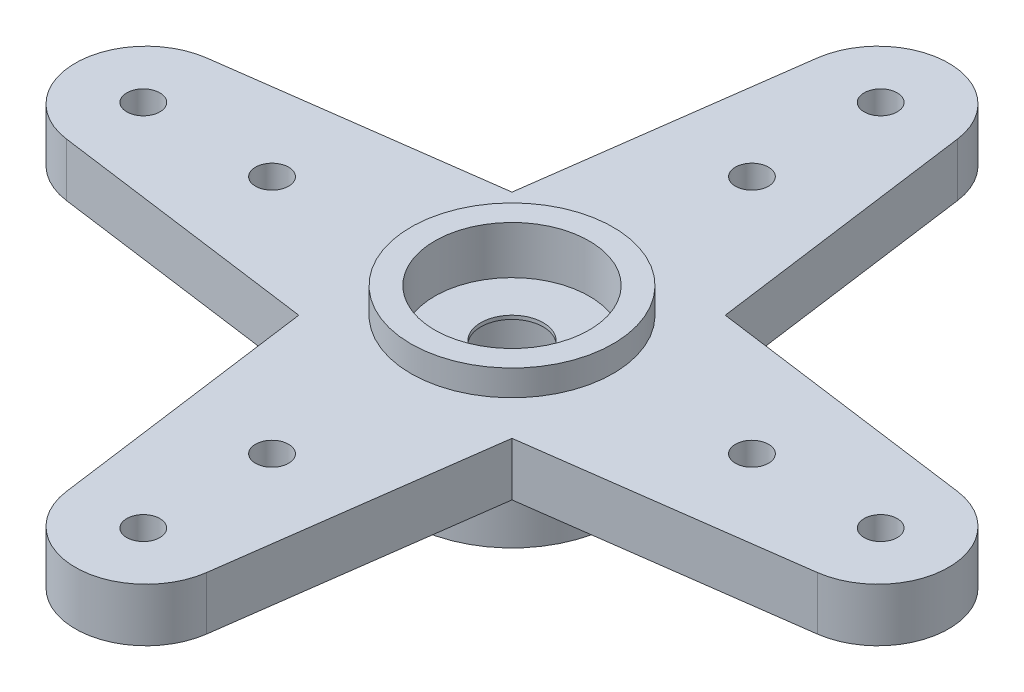
ISO-10303-21;
HEADER;
FILE_DESCRIPTION(('STEP AP214'),'2;1');
FILE_NAME('part.step','',(''),(''),'','','');
FILE_SCHEMA(('AUTOMOTIVE_DESIGN { 1 0 10303 214 1 1 1 1 }'));
ENDSEC;
DATA;
#1=APPLICATION_CONTEXT('core data for automotive mechanical design processes');
#2=APPLICATION_PROTOCOL_DEFINITION('international standard','automotive_design',2000,#1);
#3=PRODUCT_CONTEXT('',#1,'mechanical');
#4=PRODUCT('Part','Part','',(#3));
#5=PRODUCT_RELATED_PRODUCT_CATEGORY('part','',(#4));
#6=PRODUCT_DEFINITION_FORMATION('','',#4);
#7=PRODUCT_DEFINITION_CONTEXT('part definition',#1,'design');
#8=PRODUCT_DEFINITION('design','',#6,#7);
#9=PRODUCT_DEFINITION_SHAPE('','',#8);
#10=(LENGTH_UNIT() NAMED_UNIT(*) SI_UNIT(.MILLI.,.METRE.));
#11=(NAMED_UNIT(*) PLANE_ANGLE_UNIT() SI_UNIT($,.RADIAN.));
#12=(NAMED_UNIT(*) SI_UNIT($,.STERADIAN.) SOLID_ANGLE_UNIT());
#13=UNCERTAINTY_MEASURE_WITH_UNIT(LENGTH_MEASURE(1.E-05),#10,'distance_accuracy_value','');
#14=(GEOMETRIC_REPRESENTATION_CONTEXT(3) GLOBAL_UNCERTAINTY_ASSIGNED_CONTEXT((#13)) GLOBAL_UNIT_ASSIGNED_CONTEXT((#10,
#11,#12)) REPRESENTATION_CONTEXT('',''));
#15=CARTESIAN_POINT('',(0.,0.,0.));
#16=DIRECTION('',(0.,0.,1.));
#17=DIRECTION('',(1.,0.,0.));
#18=AXIS2_PLACEMENT_3D('',#15,#16,#17);
#19=CARTESIAN_POINT('',(0.,0.,0.));
#20=DIRECTION('',(0.,1.,0.));
#21=DIRECTION('',(0.,0.,1.));
#22=AXIS2_PLACEMENT_3D('',#19,#20,#21);
#23=CYLINDRICAL_SURFACE('',#22,0.85);
#24=CARTESIAN_POINT('',(0.,2.85,0.));
#25=DIRECTION('',(0.,1.,0.));
#26=DIRECTION('',(0.,0.,1.));
#27=AXIS2_PLACEMENT_3D('',#24,#25,#26);
#28=CIRCLE('',#27,0.85);
#29=CARTESIAN_POINT('',(0.,2.85,0.85));
#30=VERTEX_POINT('',#29);
#31=EDGE_CURVE('E217',#30,#30,#28,.T.);
#32=ORIENTED_EDGE('',*,*,#31,.T.);
#33=EDGE_LOOP('',(#32));
#34=FACE_BOUND('',#33,.T.);
#35=CARTESIAN_POINT('',(0.,2.75,0.));
#36=DIRECTION('',(0.,-1.,0.));
#37=DIRECTION('',(0.,0.,-1.));
#38=AXIS2_PLACEMENT_3D('',#35,#36,#37);
#39=CIRCLE('',#38,0.85);
#40=CARTESIAN_POINT('',(0.,2.75,-0.85));
#41=VERTEX_POINT('',#40);
#42=EDGE_CURVE('E39',#41,#41,#39,.F.);
#43=ORIENTED_EDGE('',*,*,#42,.F.);
#44=EDGE_LOOP('',(#43));
#45=FACE_BOUND('',#44,.T.);
#46=ADVANCED_FACE('F35',(#34,#45),#23,.F.);
#47=CARTESIAN_POINT('',(0.,0.,0.));
#48=DIRECTION('',(0.,1.,0.));
#49=DIRECTION('',(0.,0.,1.));
#50=AXIS2_PLACEMENT_3D('',#47,#48,#49);
#51=PLANE('',#50);
#52=CARTESIAN_POINT('',(0.,0.,0.));
#53=DIRECTION('',(0.,1.,0.));
#54=DIRECTION('',(0.,0.,1.));
#55=AXIS2_PLACEMENT_3D('',#52,#53,#54);
#56=CIRCLE('',#55,2.875);
#57=CARTESIAN_POINT('',(0.,0.,2.875));
#58=VERTEX_POINT('',#57);
#59=EDGE_CURVE('E45',#58,#58,#56,.T.);
#60=ORIENTED_EDGE('',*,*,#59,.F.);
#61=EDGE_LOOP('',(#60));
#62=FACE_BOUND('',#61,.T.);
#63=CARTESIAN_POINT('',(0.,0.,0.));
#64=DIRECTION('',(0.,1.,0.));
#65=DIRECTION('',(0.,0.,1.));
#66=AXIS2_PLACEMENT_3D('',#63,#64,#65);
#67=CIRCLE('',#66,1.925);
#68=CARTESIAN_POINT('',(0.,0.,1.925));
#69=VERTEX_POINT('',#68);
#70=EDGE_CURVE('E209',#69,#69,#67,.T.);
#71=ORIENTED_EDGE('',*,*,#70,.T.);
#72=EDGE_LOOP('',(#71));
#73=FACE_BOUND('',#72,.T.);
#74=ADVANCED_FACE('F346',(#62,#73),#51,.F.);
#75=CARTESIAN_POINT('',(0.,2.,0.));
#76=DIRECTION('',(0.,-1.,0.));
#77=DIRECTION('',(0.,0.,-1.));
#78=AXIS2_PLACEMENT_3D('',#75,#76,#77);
#79=CYLINDRICAL_SURFACE('',#78,2.875);
#80=CARTESIAN_POINT('',(0.,2.,0.));
#81=DIRECTION('',(0.,1.,0.));
#82=DIRECTION('',(0.,0.,1.));
#83=AXIS2_PLACEMENT_3D('',#80,#81,#82);
#84=CIRCLE('',#83,2.875);
#85=CARTESIAN_POINT('',(0.,2.,2.875));
#86=VERTEX_POINT('',#85);
#87=EDGE_CURVE('E11',#86,#86,#84,.T.);
#88=ORIENTED_EDGE('',*,*,#87,.F.);
#89=EDGE_LOOP('',(#88));
#90=FACE_BOUND('',#89,.T.);
#91=ORIENTED_EDGE('',*,*,#59,.T.);
#92=EDGE_LOOP('',(#91));
#93=FACE_BOUND('',#92,.T.);
#94=ADVANCED_FACE('F37',(#90,#93),#79,.T.);
#95=CARTESIAN_POINT('',(0.,2.,0.));
#96=DIRECTION('',(0.,-1.,0.));
#97=DIRECTION('',(0.,0.,-1.));
#98=AXIS2_PLACEMENT_3D('',#95,#96,#97);
#99=CYLINDRICAL_SURFACE('',#98,1.925);
#100=ORIENTED_EDGE('',*,*,#70,.F.);
#101=EDGE_LOOP('',(#100));
#102=FACE_BOUND('',#101,.T.);
#103=CARTESIAN_POINT('',(0.,2.75,0.));
#104=DIRECTION('',(0.,-1.,0.));
#105=DIRECTION('',(0.,0.,-1.));
#106=AXIS2_PLACEMENT_3D('',#103,#104,#105);
#107=CIRCLE('',#106,1.925);
#108=CARTESIAN_POINT('',(0.,2.75,-1.925));
#109=VERTEX_POINT('',#108);
#110=EDGE_CURVE('E254',#109,#109,#107,.T.);
#111=ORIENTED_EDGE('',*,*,#110,.F.);
#112=EDGE_LOOP('',(#111));
#113=FACE_BOUND('',#112,.T.);
#114=ADVANCED_FACE('F503',(#102,#113),#99,.F.);
#115=CARTESIAN_POINT('',(-0.4385730975185,3.45,-3.23293299338573));
#116=DIRECTION('',(-0.134426667429611,0.,-0.990923544519843));
#117=DIRECTION('',(-0.990923544519843,0.,0.134426667429611));
#118=AXIS2_PLACEMENT_3D('',#115,#116,#117);
#119=PLANE('',#118);
#120=DIRECTION('',(0.990923544519843,0.,-0.134426667429611));
#121=VECTOR('',#120,1.);
#122=CARTESIAN_POINT('',(-0.4385730975185,2.,-3.23293299338573));
#123=LINE('',#122,#121);
#124=CARTESIAN_POINT('',(-10.208771334802,2.,-1.9075278232007));
#125=VERTEX_POINT('',#124);
#126=CARTESIAN_POINT('',(-2.89913780286484,2.,-2.89913780286484));
#127=VERTEX_POINT('',#126);
#128=EDGE_CURVE('E158',#125,#127,#123,.T.);
#129=ORIENTED_EDGE('',*,*,#128,.F.);
#130=DIRECTION('',(0.,-1.,0.));
#131=VECTOR('',#130,1.);
#132=CARTESIAN_POINT('',(-10.208771334802,3.45,-1.9075278232007));
#133=LINE('',#132,#131);
#134=CARTESIAN_POINT('',(-10.208771334802,3.45,-1.9075278232007));
#135=VERTEX_POINT('',#134);
#136=EDGE_CURVE('E106',#135,#125,#133,.T.);
#137=ORIENTED_EDGE('',*,*,#136,.F.);
#138=DIRECTION('',(0.990923544519843,0.,-0.134426667429611));
#139=VECTOR('',#138,1.);
#140=CARTESIAN_POINT('',(-0.4385730975185,3.45,-3.23293299338573));
#141=LINE('',#140,#139);
#142=CARTESIAN_POINT('',(-2.89913780286484,3.45,-2.89913780286484));
#143=VERTEX_POINT('',#142);
#144=EDGE_CURVE('E187',#135,#143,#141,.T.);
#145=ORIENTED_EDGE('',*,*,#144,.T.);
#146=DIRECTION('',(0.,-1.,0.));
#147=VECTOR('',#146,1.);
#148=CARTESIAN_POINT('',(-2.89913780286484,3.45,-2.89913780286484));
#149=LINE('',#148,#147);
#150=EDGE_CURVE('E101',#143,#127,#149,.T.);
#151=ORIENTED_EDGE('',*,*,#150,.T.);
#152=EDGE_LOOP('',(#129,#137,#145,#151));
#153=FACE_BOUND('',#152,.T.);
#154=ADVANCED_FACE('F311',(#153),#119,.T.);
#155=CARTESIAN_POINT('',(-9.95,3.45,0.));
#156=DIRECTION('',(0.,-1.,0.));
#157=DIRECTION('',(0.,0.,-1.));
#158=AXIS2_PLACEMENT_3D('',#155,#156,#157);
#159=CYLINDRICAL_SURFACE('',#158,1.925);
#160=CARTESIAN_POINT('',(-9.95,2.,0.));
#161=DIRECTION('',(0.,1.,0.));
#162=DIRECTION('',(0.,0.,1.));
#163=AXIS2_PLACEMENT_3D('',#160,#161,#162);
#164=CIRCLE('',#163,1.925);
#165=CARTESIAN_POINT('',(-10.208771334802,2.,1.9075278232007));
#166=VERTEX_POINT('',#165);
#167=EDGE_CURVE('E161',#125,#166,#164,.T.);
#168=ORIENTED_EDGE('',*,*,#167,.T.);
#169=DIRECTION('',(0.,-1.,0.));
#170=VECTOR('',#169,1.);
#171=CARTESIAN_POINT('',(-10.208771334802,3.45,1.9075278232007));
#172=LINE('',#171,#170);
#173=CARTESIAN_POINT('',(-10.208771334802,3.45,1.9075278232007));
#174=VERTEX_POINT('',#173);
#175=EDGE_CURVE('E205',#174,#166,#172,.T.);
#176=ORIENTED_EDGE('',*,*,#175,.F.);
#177=CARTESIAN_POINT('',(-9.95,3.45,0.));
#178=DIRECTION('',(0.,1.,0.));
#179=DIRECTION('',(0.,0.,1.));
#180=AXIS2_PLACEMENT_3D('',#177,#178,#179);
#181=CIRCLE('',#180,1.925);
#182=EDGE_CURVE('E283',#135,#174,#181,.T.);
#183=ORIENTED_EDGE('',*,*,#182,.F.);
#184=ORIENTED_EDGE('',*,*,#136,.T.);
#185=EDGE_LOOP('',(#168,#176,#183,#184));
#186=FACE_BOUND('',#185,.T.);
#187=ADVANCED_FACE('F317',(#186),#159,.T.);
#188=CARTESIAN_POINT('',(-0.4385730975185,3.45,3.23293299338573));
#189=DIRECTION('',(0.134426667429611,0.,-0.990923544519843));
#190=DIRECTION('',(-0.990923544519843,0.,-0.134426667429611));
#191=AXIS2_PLACEMENT_3D('',#188,#189,#190);
#192=PLANE('',#191);
#193=DIRECTION('',(0.990923544519843,0.,0.134426667429611));
#194=VECTOR('',#193,1.);
#195=CARTESIAN_POINT('',(-0.4385730975185,2.,3.23293299338573));
#196=LINE('',#195,#194);
#197=CARTESIAN_POINT('',(-2.89913780286484,2.,2.89913780286484));
#198=VERTEX_POINT('',#197);
#199=EDGE_CURVE('E164',#166,#198,#196,.T.);
#200=ORIENTED_EDGE('',*,*,#199,.T.);
#201=DIRECTION('',(0.,-1.,0.));
#202=VECTOR('',#201,1.);
#203=CARTESIAN_POINT('',(-2.89913780286484,3.45,2.89913780286484));
#204=LINE('',#203,#202);
#205=CARTESIAN_POINT('',(-2.89913780286484,3.45,2.89913780286484));
#206=VERTEX_POINT('',#205);
#207=EDGE_CURVE('E203',#206,#198,#204,.T.);
#208=ORIENTED_EDGE('',*,*,#207,.F.);
#209=DIRECTION('',(0.990923544519843,0.,0.134426667429611));
#210=VECTOR('',#209,1.);
#211=CARTESIAN_POINT('',(-0.4385730975185,3.45,3.23293299338573));
#212=LINE('',#211,#210);
#213=EDGE_CURVE('E285',#174,#206,#212,.T.);
#214=ORIENTED_EDGE('',*,*,#213,.F.);
#215=ORIENTED_EDGE('',*,*,#175,.T.);
#216=EDGE_LOOP('',(#200,#208,#214,#215));
#217=FACE_BOUND('',#216,.T.);
#218=ADVANCED_FACE('F320',(#217),#192,.F.);
#219=CARTESIAN_POINT('',(-3.23293299338573,3.45,0.438573097518499));
#220=DIRECTION('',(-0.990923544519843,0.,0.13442666742961));
#221=DIRECTION('',(0.13442666742961,0.,0.990923544519843));
#222=AXIS2_PLACEMENT_3D('',#219,#220,#221);
#223=PLANE('',#222);
#224=DIRECTION('',(-0.13442666742961,0.,-0.990923544519843));
#225=VECTOR('',#224,1.);
#226=CARTESIAN_POINT('',(-3.23293299338573,2.,0.438573097518499));
#227=LINE('',#226,#225);
#228=CARTESIAN_POINT('',(-1.9075278232007,2.,10.208771334802));
#229=VERTEX_POINT('',#228);
#230=EDGE_CURVE('E167',#229,#198,#227,.T.);
#231=ORIENTED_EDGE('',*,*,#230,.F.);
#232=DIRECTION('',(0.,-1.,0.));
#233=VECTOR('',#232,1.);
#234=CARTESIAN_POINT('',(-1.9075278232007,3.45,10.208771334802));
#235=LINE('',#234,#233);
#236=CARTESIAN_POINT('',(-1.9075278232007,3.45,10.208771334802));
#237=VERTEX_POINT('',#236);
#238=EDGE_CURVE('E201',#237,#229,#235,.T.);
#239=ORIENTED_EDGE('',*,*,#238,.F.);
#240=DIRECTION('',(-0.13442666742961,0.,-0.990923544519843));
#241=VECTOR('',#240,1.);
#242=CARTESIAN_POINT('',(-3.23293299338573,3.45,0.438573097518499));
#243=LINE('',#242,#241);
#244=EDGE_CURVE('E287',#237,#206,#243,.T.);
#245=ORIENTED_EDGE('',*,*,#244,.T.);
#246=ORIENTED_EDGE('',*,*,#207,.T.);
#247=EDGE_LOOP('',(#231,#239,#245,#246));
#248=FACE_BOUND('',#247,.T.);
#249=ADVANCED_FACE('F323',(#248),#223,.T.);
#250=CARTESIAN_POINT('',(0.,3.45,9.95));
#251=DIRECTION('',(0.,-1.,0.));
#252=DIRECTION('',(0.,0.,-1.));
#253=AXIS2_PLACEMENT_3D('',#250,#251,#252);
#254=CYLINDRICAL_SURFACE('',#253,1.925);
#255=CARTESIAN_POINT('',(0.,2.,9.95));
#256=DIRECTION('',(0.,1.,0.));
#257=DIRECTION('',(0.,0.,1.));
#258=AXIS2_PLACEMENT_3D('',#255,#256,#257);
#259=CIRCLE('',#258,1.925);
#260=CARTESIAN_POINT('',(1.9075278232007,2.,10.208771334802));
#261=VERTEX_POINT('',#260);
#262=EDGE_CURVE('E170',#229,#261,#259,.T.);
#263=ORIENTED_EDGE('',*,*,#262,.T.);
#264=DIRECTION('',(0.,-1.,0.));
#265=VECTOR('',#264,1.);
#266=CARTESIAN_POINT('',(1.9075278232007,3.45,10.208771334802));
#267=LINE('',#266,#265);
#268=CARTESIAN_POINT('',(1.9075278232007,3.45,10.208771334802));
#269=VERTEX_POINT('',#268);
#270=EDGE_CURVE('E198',#269,#261,#267,.T.);
#271=ORIENTED_EDGE('',*,*,#270,.F.);
#272=CARTESIAN_POINT('',(0.,3.45,9.95));
#273=DIRECTION('',(0.,1.,0.));
#274=DIRECTION('',(0.,0.,1.));
#275=AXIS2_PLACEMENT_3D('',#272,#273,#274);
#276=CIRCLE('',#275,1.925);
#277=EDGE_CURVE('E290',#237,#269,#276,.T.);
#278=ORIENTED_EDGE('',*,*,#277,.F.);
#279=ORIENTED_EDGE('',*,*,#238,.T.);
#280=EDGE_LOOP('',(#263,#271,#278,#279));
#281=FACE_BOUND('',#280,.T.);
#282=ADVANCED_FACE('F329',(#281),#254,.T.);
#283=CARTESIAN_POINT('',(3.23293299338573,3.45,0.438573097518499));
#284=DIRECTION('',(-0.990923544519843,0.,-0.13442666742961));
#285=DIRECTION('',(-0.13442666742961,0.,0.990923544519843));
#286=AXIS2_PLACEMENT_3D('',#283,#284,#285);
#287=PLANE('',#286);
#288=DIRECTION('',(0.13442666742961,0.,-0.990923544519843));
#289=VECTOR('',#288,1.);
#290=CARTESIAN_POINT('',(3.23293299338573,2.,0.438573097518499));
#291=LINE('',#290,#289);
#292=CARTESIAN_POINT('',(2.89913780286484,2.,2.89913780286484));
#293=VERTEX_POINT('',#292);
#294=EDGE_CURVE('E172',#261,#293,#291,.T.);
#295=ORIENTED_EDGE('',*,*,#294,.T.);
#296=DIRECTION('',(0.,-1.,0.));
#297=VECTOR('',#296,1.);
#298=CARTESIAN_POINT('',(2.89913780286484,3.45,2.89913780286484));
#299=LINE('',#298,#297);
#300=CARTESIAN_POINT('',(2.89913780286484,3.45,2.89913780286484));
#301=VERTEX_POINT('',#300);
#302=EDGE_CURVE('E196',#301,#293,#299,.T.);
#303=ORIENTED_EDGE('',*,*,#302,.F.);
#304=DIRECTION('',(0.13442666742961,0.,-0.990923544519843));
#305=VECTOR('',#304,1.);
#306=CARTESIAN_POINT('',(3.23293299338573,3.45,0.438573097518499));
#307=LINE('',#306,#305);
#308=EDGE_CURVE('E292',#269,#301,#307,.T.);
#309=ORIENTED_EDGE('',*,*,#308,.F.);
#310=ORIENTED_EDGE('',*,*,#270,.T.);
#311=EDGE_LOOP('',(#295,#303,#309,#310));
#312=FACE_BOUND('',#311,.T.);
#313=ADVANCED_FACE('F333',(#312),#287,.F.);
#314=CARTESIAN_POINT('',(0.4385730975185,3.45,3.23293299338573));
#315=DIRECTION('',(0.134426667429611,0.,0.990923544519843));
#316=DIRECTION('',(0.990923544519843,0.,-0.134426667429611));
#317=AXIS2_PLACEMENT_3D('',#314,#315,#316);
#318=PLANE('',#317);
#319=DIRECTION('',(-0.990923544519843,0.,0.134426667429611));
#320=VECTOR('',#319,1.);
#321=CARTESIAN_POINT('',(0.4385730975185,2.,3.23293299338573));
#322=LINE('',#321,#320);
#323=CARTESIAN_POINT('',(10.208771334802,2.,1.9075278232007));
#324=VERTEX_POINT('',#323);
#325=EDGE_CURVE('E175',#324,#293,#322,.T.);
#326=ORIENTED_EDGE('',*,*,#325,.F.);
#327=DIRECTION('',(0.,-1.,0.));
#328=VECTOR('',#327,1.);
#329=CARTESIAN_POINT('',(10.208771334802,3.45,1.9075278232007));
#330=LINE('',#329,#328);
#331=CARTESIAN_POINT('',(10.208771334802,3.45,1.9075278232007));
#332=VERTEX_POINT('',#331);
#333=EDGE_CURVE('E194',#332,#324,#330,.T.);
#334=ORIENTED_EDGE('',*,*,#333,.F.);
#335=DIRECTION('',(-0.990923544519843,0.,0.134426667429611));
#336=VECTOR('',#335,1.);
#337=CARTESIAN_POINT('',(0.4385730975185,3.45,3.23293299338573));
#338=LINE('',#337,#336);
#339=EDGE_CURVE('E294',#332,#301,#338,.T.);
#340=ORIENTED_EDGE('',*,*,#339,.T.);
#341=ORIENTED_EDGE('',*,*,#302,.T.);
#342=EDGE_LOOP('',(#326,#334,#340,#341));
#343=FACE_BOUND('',#342,.T.);
#344=ADVANCED_FACE('F336',(#343),#318,.T.);
#345=CARTESIAN_POINT('',(9.95,3.45,0.));
#346=DIRECTION('',(0.,-1.,0.));
#347=DIRECTION('',(0.,0.,-1.));
#348=AXIS2_PLACEMENT_3D('',#345,#346,#347);
#349=CYLINDRICAL_SURFACE('',#348,1.925);
#350=CARTESIAN_POINT('',(9.95,2.,0.));
#351=DIRECTION('',(0.,1.,0.));
#352=DIRECTION('',(0.,0.,1.));
#353=AXIS2_PLACEMENT_3D('',#350,#351,#352);
#354=CIRCLE('',#353,1.925);
#355=CARTESIAN_POINT('',(10.208771334802,2.,-1.9075278232007));
#356=VERTEX_POINT('',#355);
#357=EDGE_CURVE('E178',#324,#356,#354,.T.);
#358=ORIENTED_EDGE('',*,*,#357,.T.);
#359=DIRECTION('',(0.,-1.,0.));
#360=VECTOR('',#359,1.);
#361=CARTESIAN_POINT('',(10.208771334802,3.45,-1.9075278232007));
#362=LINE('',#361,#360);
#363=CARTESIAN_POINT('',(10.208771334802,3.45,-1.9075278232007));
#364=VERTEX_POINT('',#363);
#365=EDGE_CURVE('E191',#364,#356,#362,.T.);
#366=ORIENTED_EDGE('',*,*,#365,.F.);
#367=CARTESIAN_POINT('',(9.95,3.45,0.));
#368=DIRECTION('',(0.,1.,0.));
#369=DIRECTION('',(0.,0.,1.));
#370=AXIS2_PLACEMENT_3D('',#367,#368,#369);
#371=CIRCLE('',#370,1.925);
#372=EDGE_CURVE('E153',#332,#364,#371,.T.);
#373=ORIENTED_EDGE('',*,*,#372,.F.);
#374=ORIENTED_EDGE('',*,*,#333,.T.);
#375=EDGE_LOOP('',(#358,#366,#373,#374));
#376=FACE_BOUND('',#375,.T.);
#377=ADVANCED_FACE('F300',(#376),#349,.T.);
#378=CARTESIAN_POINT('',(0.4385730975185,3.45,-3.23293299338573));
#379=DIRECTION('',(-0.134426667429611,0.,0.990923544519843));
#380=DIRECTION('',(0.990923544519843,0.,0.134426667429611));
#381=AXIS2_PLACEMENT_3D('',#378,#379,#380);
#382=PLANE('',#381);
#383=DIRECTION('',(-0.990923544519843,0.,-0.134426667429611));
#384=VECTOR('',#383,1.);
#385=CARTESIAN_POINT('',(0.4385730975185,2.,-3.23293299338573));
#386=LINE('',#385,#384);
#387=CARTESIAN_POINT('',(2.89913780286484,2.,-2.89913780286484));
#388=VERTEX_POINT('',#387);
#389=EDGE_CURVE('E180',#356,#388,#386,.T.);
#390=ORIENTED_EDGE('',*,*,#389,.T.);
#391=DIRECTION('',(0.,-1.,0.));
#392=VECTOR('',#391,1.);
#393=CARTESIAN_POINT('',(2.89913780286484,3.45,-2.89913780286484));
#394=LINE('',#393,#392);
#395=CARTESIAN_POINT('',(2.89913780286484,3.45,-2.89913780286484));
#396=VERTEX_POINT('',#395);
#397=EDGE_CURVE('E142',#396,#388,#394,.T.);
#398=ORIENTED_EDGE('',*,*,#397,.F.);
#399=DIRECTION('',(-0.990923544519843,0.,-0.134426667429611));
#400=VECTOR('',#399,1.);
#401=CARTESIAN_POINT('',(0.4385730975185,3.45,-3.23293299338573));
#402=LINE('',#401,#400);
#403=EDGE_CURVE('E150',#364,#396,#402,.T.);
#404=ORIENTED_EDGE('',*,*,#403,.F.);
#405=ORIENTED_EDGE('',*,*,#365,.T.);
#406=EDGE_LOOP('',(#390,#398,#404,#405));
#407=FACE_BOUND('',#406,.T.);
#408=ADVANCED_FACE('F304',(#407),#382,.F.);
#409=CARTESIAN_POINT('',(3.23293299338573,3.45,-0.438573097518499));
#410=DIRECTION('',(0.990923544519843,0.,-0.13442666742961));
#411=DIRECTION('',(-0.13442666742961,0.,-0.990923544519843));
#412=AXIS2_PLACEMENT_3D('',#409,#410,#411);
#413=PLANE('',#412);
#414=DIRECTION('',(0.13442666742961,0.,0.990923544519843));
#415=VECTOR('',#414,1.);
#416=CARTESIAN_POINT('',(3.23293299338573,2.,-0.438573097518499));
#417=LINE('',#416,#415);
#418=CARTESIAN_POINT('',(1.9075278232007,2.,-10.208771334802));
#419=VERTEX_POINT('',#418);
#420=EDGE_CURVE('E141',#419,#388,#417,.T.);
#421=ORIENTED_EDGE('',*,*,#420,.F.);
#422=DIRECTION('',(0.,-1.,0.));
#423=VECTOR('',#422,1.);
#424=CARTESIAN_POINT('',(1.9075278232007,3.45,-10.208771334802));
#425=LINE('',#424,#423);
#426=CARTESIAN_POINT('',(1.9075278232007,3.45,-10.208771334802));
#427=VERTEX_POINT('',#426);
#428=EDGE_CURVE('E135',#427,#419,#425,.T.);
#429=ORIENTED_EDGE('',*,*,#428,.F.);
#430=DIRECTION('',(0.13442666742961,0.,0.990923544519843));
#431=VECTOR('',#430,1.);
#432=CARTESIAN_POINT('',(3.23293299338573,3.45,-0.438573097518499));
#433=LINE('',#432,#431);
#434=EDGE_CURVE('E139',#427,#396,#433,.T.);
#435=ORIENTED_EDGE('',*,*,#434,.T.);
#436=ORIENTED_EDGE('',*,*,#397,.T.);
#437=EDGE_LOOP('',(#421,#429,#435,#436));
#438=FACE_BOUND('',#437,.T.);
#439=ADVANCED_FACE('F137',(#438),#413,.T.);
#440=CARTESIAN_POINT('',(0.,3.45,-9.95));
#441=DIRECTION('',(0.,-1.,0.));
#442=DIRECTION('',(0.,0.,-1.));
#443=AXIS2_PLACEMENT_3D('',#440,#441,#442);
#444=CYLINDRICAL_SURFACE('',#443,1.925);
#445=CARTESIAN_POINT('',(0.,2.,-9.95));
#446=DIRECTION('',(0.,1.,0.));
#447=DIRECTION('',(0.,0.,1.));
#448=AXIS2_PLACEMENT_3D('',#445,#446,#447);
#449=CIRCLE('',#448,1.925);
#450=CARTESIAN_POINT('',(-1.9075278232007,2.,-10.208771334802));
#451=VERTEX_POINT('',#450);
#452=EDGE_CURVE('E94',#419,#451,#449,.T.);
#453=ORIENTED_EDGE('',*,*,#452,.T.);
#454=DIRECTION('',(0.,-1.,0.));
#455=VECTOR('',#454,1.);
#456=CARTESIAN_POINT('',(-1.9075278232007,3.45,-10.208771334802));
#457=LINE('',#456,#455);
#458=CARTESIAN_POINT('',(-1.9075278232007,3.45,-10.208771334802));
#459=VERTEX_POINT('',#458);
#460=EDGE_CURVE('E143',#459,#451,#457,.T.);
#461=ORIENTED_EDGE('',*,*,#460,.F.);
#462=CARTESIAN_POINT('',(0.,3.45,-9.95));
#463=DIRECTION('',(0.,1.,0.));
#464=DIRECTION('',(0.,0.,1.));
#465=AXIS2_PLACEMENT_3D('',#462,#463,#464);
#466=CIRCLE('',#465,1.925);
#467=EDGE_CURVE('E145',#427,#459,#466,.T.);
#468=ORIENTED_EDGE('',*,*,#467,.F.);
#469=ORIENTED_EDGE('',*,*,#428,.T.);
#470=EDGE_LOOP('',(#453,#461,#468,#469));
#471=FACE_BOUND('',#470,.T.);
#472=ADVANCED_FACE('F146',(#471),#444,.T.);
#473=CARTESIAN_POINT('',(-3.23293299338573,3.45,-0.438573097518499));
#474=DIRECTION('',(0.990923544519843,0.,0.13442666742961));
#475=DIRECTION('',(0.13442666742961,0.,-0.990923544519843));
#476=AXIS2_PLACEMENT_3D('',#473,#474,#475);
#477=PLANE('',#476);
#478=DIRECTION('',(-0.13442666742961,0.,0.990923544519843));
#479=VECTOR('',#478,1.);
#480=CARTESIAN_POINT('',(-3.23293299338573,2.,-0.438573097518499));
#481=LINE('',#480,#479);
#482=EDGE_CURVE('E185',#451,#127,#481,.T.);
#483=ORIENTED_EDGE('',*,*,#482,.T.);
#484=ORIENTED_EDGE('',*,*,#150,.F.);
#485=DIRECTION('',(-0.13442666742961,0.,0.990923544519843));
#486=VECTOR('',#485,1.);
#487=CARTESIAN_POINT('',(-3.23293299338573,3.45,-0.438573097518499));
#488=LINE('',#487,#486);
#489=EDGE_CURVE('E54',#459,#143,#488,.T.);
#490=ORIENTED_EDGE('',*,*,#489,.F.);
#491=ORIENTED_EDGE('',*,*,#460,.T.);
#492=EDGE_LOOP('',(#483,#484,#490,#491));
#493=FACE_BOUND('',#492,.T.);
#494=ADVANCED_FACE('F310',(#493),#477,.F.);
#495=CARTESIAN_POINT('',(0.,3.45,0.));
#496=DIRECTION('',(0.,1.,0.));
#497=DIRECTION('',(0.,0.,1.));
#498=AXIS2_PLACEMENT_3D('',#495,#496,#497);
#499=PLANE('',#498);
#500=CARTESIAN_POINT('',(-10.025,3.45,0.));
#501=DIRECTION('',(0.,1.,0.));
#502=DIRECTION('',(0.,0.,1.));
#503=AXIS2_PLACEMENT_3D('',#500,#501,#502);
#504=CIRCLE('',#503,0.45);
#505=CARTESIAN_POINT('',(-10.025,3.45,0.45));
#506=VERTEX_POINT('',#505);
#507=EDGE_CURVE('E244',#506,#506,#504,.T.);
#508=ORIENTED_EDGE('',*,*,#507,.F.);
#509=EDGE_LOOP('',(#508));
#510=FACE_BOUND('',#509,.T.);
#511=CARTESIAN_POINT('',(-6.525,3.45,0.));
#512=DIRECTION('',(0.,1.,0.));
#513=DIRECTION('',(0.,0.,1.));
#514=AXIS2_PLACEMENT_3D('',#511,#512,#513);
#515=CIRCLE('',#514,0.45);
#516=CARTESIAN_POINT('',(-6.525,3.45,0.45));
#517=VERTEX_POINT('',#516);
#518=EDGE_CURVE('E241',#517,#517,#515,.T.);
#519=ORIENTED_EDGE('',*,*,#518,.F.);
#520=EDGE_LOOP('',(#519));
#521=FACE_BOUND('',#520,.T.);
#522=CARTESIAN_POINT('',(0.,3.45,10.025));
#523=DIRECTION('',(0.,1.,0.));
#524=DIRECTION('',(0.,0.,1.));
#525=AXIS2_PLACEMENT_3D('',#522,#523,#524);
#526=CIRCLE('',#525,0.45);
#527=CARTESIAN_POINT('',(0.,3.45,10.475));
#528=VERTEX_POINT('',#527);
#529=EDGE_CURVE('E238',#528,#528,#526,.T.);
#530=ORIENTED_EDGE('',*,*,#529,.F.);
#531=EDGE_LOOP('',(#530));
#532=FACE_BOUND('',#531,.T.);
#533=CARTESIAN_POINT('',(0.,3.45,6.525));
#534=DIRECTION('',(0.,1.,0.));
#535=DIRECTION('',(0.,0.,1.));
#536=AXIS2_PLACEMENT_3D('',#533,#534,#535);
#537=CIRCLE('',#536,0.45);
#538=CARTESIAN_POINT('',(0.,3.45,6.975));
#539=VERTEX_POINT('',#538);
#540=EDGE_CURVE('E234',#539,#539,#537,.T.);
#541=ORIENTED_EDGE('',*,*,#540,.F.);
#542=EDGE_LOOP('',(#541));
#543=FACE_BOUND('',#542,.T.);
#544=CARTESIAN_POINT('',(10.025,3.45,0.));
#545=DIRECTION('',(0.,1.,0.));
#546=DIRECTION('',(0.,0.,1.));
#547=AXIS2_PLACEMENT_3D('',#544,#545,#546);
#548=CIRCLE('',#547,0.45);
#549=CARTESIAN_POINT('',(10.025,3.45,0.45));
#550=VERTEX_POINT('',#549);
#551=EDGE_CURVE('E230',#550,#550,#548,.T.);
#552=ORIENTED_EDGE('',*,*,#551,.F.);
#553=EDGE_LOOP('',(#552));
#554=FACE_BOUND('',#553,.T.);
#555=CARTESIAN_POINT('',(6.525,3.45,0.));
#556=DIRECTION('',(0.,1.,0.));
#557=DIRECTION('',(0.,0.,1.));
#558=AXIS2_PLACEMENT_3D('',#555,#556,#557);
#559=CIRCLE('',#558,0.45);
#560=CARTESIAN_POINT('',(6.525,3.45,0.45));
#561=VERTEX_POINT('',#560);
#562=EDGE_CURVE('E226',#561,#561,#559,.T.);
#563=ORIENTED_EDGE('',*,*,#562,.F.);
#564=EDGE_LOOP('',(#563));
#565=FACE_BOUND('',#564,.T.);
#566=CARTESIAN_POINT('',(0.,3.45,-6.525));
#567=DIRECTION('',(0.,1.,0.));
#568=DIRECTION('',(0.,0.,1.));
#569=AXIS2_PLACEMENT_3D('',#566,#567,#568);
#570=CIRCLE('',#569,0.45);
#571=CARTESIAN_POINT('',(0.,3.45,-6.075));
#572=VERTEX_POINT('',#571);
#573=EDGE_CURVE('E222',#572,#572,#570,.T.);
#574=ORIENTED_EDGE('',*,*,#573,.F.);
#575=EDGE_LOOP('',(#574));
#576=FACE_BOUND('',#575,.T.);
#577=CARTESIAN_POINT('',(0.,3.45,-10.025));
#578=DIRECTION('',(0.,1.,0.));
#579=DIRECTION('',(0.,0.,1.));
#580=AXIS2_PLACEMENT_3D('',#577,#578,#579);
#581=CIRCLE('',#580,0.450000000000001);
#582=CARTESIAN_POINT('',(0.,3.45,-9.575));
#583=VERTEX_POINT('',#582);
#584=EDGE_CURVE('E218',#583,#583,#581,.T.);
#585=ORIENTED_EDGE('',*,*,#584,.F.);
#586=EDGE_LOOP('',(#585));
#587=FACE_BOUND('',#586,.T.);
#588=CARTESIAN_POINT('',(0.,3.45,0.));
#589=DIRECTION('',(0.,1.,0.));
#590=DIRECTION('',(0.,0.,1.));
#591=AXIS2_PLACEMENT_3D('',#588,#589,#590);
#592=CIRCLE('',#591,2.75);
#593=CARTESIAN_POINT('',(0.,3.45,2.75));
#594=VERTEX_POINT('',#593);
#595=EDGE_CURVE('E277',#594,#594,#592,.T.);
#596=ORIENTED_EDGE('',*,*,#595,.F.);
#597=EDGE_LOOP('',(#596));
#598=FACE_BOUND('',#597,.T.);
#599=ORIENTED_EDGE('',*,*,#144,.F.);
#600=ORIENTED_EDGE('',*,*,#182,.T.);
#601=ORIENTED_EDGE('',*,*,#213,.T.);
#602=ORIENTED_EDGE('',*,*,#244,.F.);
#603=ORIENTED_EDGE('',*,*,#277,.T.);
#604=ORIENTED_EDGE('',*,*,#308,.T.);
#605=ORIENTED_EDGE('',*,*,#339,.F.);
#606=ORIENTED_EDGE('',*,*,#372,.T.);
#607=ORIENTED_EDGE('',*,*,#403,.T.);
#608=ORIENTED_EDGE('',*,*,#434,.F.);
#609=ORIENTED_EDGE('',*,*,#467,.T.);
#610=ORIENTED_EDGE('',*,*,#489,.T.);
#611=EDGE_LOOP('',(#599,#600,#601,#602,#603,#604,#605,#606,#607,#608,#609,#610));
#612=FACE_BOUND('',#611,.T.);
#613=ADVANCED_FACE('F148',(#510,#521,#532,#543,#554,#565,#576,#587,#598,#612),#499,.T.);
#614=CARTESIAN_POINT('',(0.,2.,0.));
#615=DIRECTION('',(0.,1.,0.));
#616=DIRECTION('',(0.,0.,1.));
#617=AXIS2_PLACEMENT_3D('',#614,#615,#616);
#618=PLANE('',#617);
#619=CARTESIAN_POINT('',(-10.025,2.,0.));
#620=DIRECTION('',(0.,1.,0.));
#621=DIRECTION('',(0.,0.,1.));
#622=AXIS2_PLACEMENT_3D('',#619,#620,#621);
#623=CIRCLE('',#622,0.45);
#624=CARTESIAN_POINT('',(-10.025,2.,0.45));
#625=VERTEX_POINT('',#624);
#626=EDGE_CURVE('E242',#625,#625,#623,.T.);
#627=ORIENTED_EDGE('',*,*,#626,.T.);
#628=EDGE_LOOP('',(#627));
#629=FACE_BOUND('',#628,.T.);
#630=CARTESIAN_POINT('',(-6.525,2.,0.));
#631=DIRECTION('',(0.,1.,0.));
#632=DIRECTION('',(0.,0.,1.));
#633=AXIS2_PLACEMENT_3D('',#630,#631,#632);
#634=CIRCLE('',#633,0.45);
#635=CARTESIAN_POINT('',(-6.525,2.,0.45));
#636=VERTEX_POINT('',#635);
#637=EDGE_CURVE('E239',#636,#636,#634,.T.);
#638=ORIENTED_EDGE('',*,*,#637,.T.);
#639=EDGE_LOOP('',(#638));
#640=FACE_BOUND('',#639,.T.);
#641=CARTESIAN_POINT('',(0.,2.,10.025));
#642=DIRECTION('',(0.,1.,0.));
#643=DIRECTION('',(0.,0.,1.));
#644=AXIS2_PLACEMENT_3D('',#641,#642,#643);
#645=CIRCLE('',#644,0.45);
#646=CARTESIAN_POINT('',(0.,2.,10.475));
#647=VERTEX_POINT('',#646);
#648=EDGE_CURVE('E235',#647,#647,#645,.T.);
#649=ORIENTED_EDGE('',*,*,#648,.T.);
#650=EDGE_LOOP('',(#649));
#651=FACE_BOUND('',#650,.T.);
#652=CARTESIAN_POINT('',(0.,2.,6.525));
#653=DIRECTION('',(0.,1.,0.));
#654=DIRECTION('',(0.,0.,1.));
#655=AXIS2_PLACEMENT_3D('',#652,#653,#654);
#656=CIRCLE('',#655,0.45);
#657=CARTESIAN_POINT('',(0.,2.,6.975));
#658=VERTEX_POINT('',#657);
#659=EDGE_CURVE('E231',#658,#658,#656,.T.);
#660=ORIENTED_EDGE('',*,*,#659,.T.);
#661=EDGE_LOOP('',(#660));
#662=FACE_BOUND('',#661,.T.);
#663=CARTESIAN_POINT('',(10.025,2.,0.));
#664=DIRECTION('',(0.,1.,0.));
#665=DIRECTION('',(0.,0.,1.));
#666=AXIS2_PLACEMENT_3D('',#663,#664,#665);
#667=CIRCLE('',#666,0.45);
#668=CARTESIAN_POINT('',(10.025,2.,0.45));
#669=VERTEX_POINT('',#668);
#670=EDGE_CURVE('E227',#669,#669,#667,.T.);
#671=ORIENTED_EDGE('',*,*,#670,.T.);
#672=EDGE_LOOP('',(#671));
#673=FACE_BOUND('',#672,.T.);
#674=CARTESIAN_POINT('',(6.525,2.,0.));
#675=DIRECTION('',(0.,1.,0.));
#676=DIRECTION('',(0.,0.,1.));
#677=AXIS2_PLACEMENT_3D('',#674,#675,#676);
#678=CIRCLE('',#677,0.45);
#679=CARTESIAN_POINT('',(6.525,2.,0.45));
#680=VERTEX_POINT('',#679);
#681=EDGE_CURVE('E223',#680,#680,#678,.T.);
#682=ORIENTED_EDGE('',*,*,#681,.T.);
#683=EDGE_LOOP('',(#682));
#684=FACE_BOUND('',#683,.T.);
#685=CARTESIAN_POINT('',(0.,2.,-6.525));
#686=DIRECTION('',(0.,1.,0.));
#687=DIRECTION('',(0.,0.,1.));
#688=AXIS2_PLACEMENT_3D('',#685,#686,#687);
#689=CIRCLE('',#688,0.45);
#690=CARTESIAN_POINT('',(0.,2.,-6.075));
#691=VERTEX_POINT('',#690);
#692=EDGE_CURVE('E219',#691,#691,#689,.T.);
#693=ORIENTED_EDGE('',*,*,#692,.T.);
#694=EDGE_LOOP('',(#693));
#695=FACE_BOUND('',#694,.T.);
#696=CARTESIAN_POINT('',(0.,2.,-10.025));
#697=DIRECTION('',(0.,1.,0.));
#698=DIRECTION('',(0.,0.,1.));
#699=AXIS2_PLACEMENT_3D('',#696,#697,#698);
#700=CIRCLE('',#699,0.450000000000001);
#701=CARTESIAN_POINT('',(0.,2.,-9.575));
#702=VERTEX_POINT('',#701);
#703=EDGE_CURVE('E214',#702,#702,#700,.T.);
#704=ORIENTED_EDGE('',*,*,#703,.T.);
#705=EDGE_LOOP('',(#704));
#706=FACE_BOUND('',#705,.T.);
#707=ORIENTED_EDGE('',*,*,#87,.T.);
#708=EDGE_LOOP('',(#707));
#709=FACE_BOUND('',#708,.T.);
#710=ORIENTED_EDGE('',*,*,#128,.T.);
#711=ORIENTED_EDGE('',*,*,#482,.F.);
#712=ORIENTED_EDGE('',*,*,#452,.F.);
#713=ORIENTED_EDGE('',*,*,#420,.T.);
#714=ORIENTED_EDGE('',*,*,#389,.F.);
#715=ORIENTED_EDGE('',*,*,#357,.F.);
#716=ORIENTED_EDGE('',*,*,#325,.T.);
#717=ORIENTED_EDGE('',*,*,#294,.F.);
#718=ORIENTED_EDGE('',*,*,#262,.F.);
#719=ORIENTED_EDGE('',*,*,#230,.T.);
#720=ORIENTED_EDGE('',*,*,#199,.F.);
#721=ORIENTED_EDGE('',*,*,#167,.F.);
#722=EDGE_LOOP('',(#710,#711,#712,#713,#714,#715,#716,#717,#718,#719,#720,#721));
#723=FACE_BOUND('',#722,.T.);
#724=ADVANCED_FACE('F306',(#629,#640,#651,#662,#673,#684,#695,#706,#709,#723),#618,.F.);
#725=CARTESIAN_POINT('',(0.,4.15,0.));
#726=DIRECTION('',(0.,1.,0.));
#727=DIRECTION('',(0.,0.,1.));
#728=AXIS2_PLACEMENT_3D('',#725,#726,#727);
#729=PLANE('',#728);
#730=CARTESIAN_POINT('',(0.,4.15,0.));
#731=DIRECTION('',(0.,1.,0.));
#732=DIRECTION('',(0.,0.,1.));
#733=AXIS2_PLACEMENT_3D('',#730,#731,#732);
#734=CIRCLE('',#733,2.75);
#735=CARTESIAN_POINT('',(0.,4.15,2.75));
#736=VERTEX_POINT('',#735);
#737=EDGE_CURVE('E162',#736,#736,#734,.T.);
#738=ORIENTED_EDGE('',*,*,#737,.T.);
#739=EDGE_LOOP('',(#738));
#740=FACE_BOUND('',#739,.T.);
#741=CARTESIAN_POINT('',(0.,4.15,0.));
#742=DIRECTION('',(0.,1.,0.));
#743=DIRECTION('',(0.,0.,1.));
#744=AXIS2_PLACEMENT_3D('',#741,#742,#743);
#745=CIRCLE('',#744,2.1);
#746=CARTESIAN_POINT('',(0.,4.15,2.1));
#747=VERTEX_POINT('',#746);
#748=EDGE_CURVE('E274',#747,#747,#745,.T.);
#749=ORIENTED_EDGE('',*,*,#748,.F.);
#750=EDGE_LOOP('',(#749));
#751=FACE_BOUND('',#750,.T.);
#752=ADVANCED_FACE('F369',(#740,#751),#729,.T.);
#753=CARTESIAN_POINT('',(0.,4.15,0.));
#754=DIRECTION('',(0.,-1.,0.));
#755=DIRECTION('',(0.,0.,-1.));
#756=AXIS2_PLACEMENT_3D('',#753,#754,#755);
#757=CYLINDRICAL_SURFACE('',#756,2.75);
#758=ORIENTED_EDGE('',*,*,#737,.F.);
#759=EDGE_LOOP('',(#758));
#760=FACE_BOUND('',#759,.T.);
#761=ORIENTED_EDGE('',*,*,#595,.T.);
#762=EDGE_LOOP('',(#761));
#763=FACE_BOUND('',#762,.T.);
#764=ADVANCED_FACE('F367',(#760,#763),#757,.T.);
#765=CARTESIAN_POINT('',(0.,4.15,0.));
#766=DIRECTION('',(0.,-1.,0.));
#767=DIRECTION('',(0.,0.,-1.));
#768=AXIS2_PLACEMENT_3D('',#765,#766,#767);
#769=CYLINDRICAL_SURFACE('',#768,2.1);
#770=ORIENTED_EDGE('',*,*,#748,.T.);
#771=EDGE_LOOP('',(#770));
#772=FACE_BOUND('',#771,.T.);
#773=CARTESIAN_POINT('',(0.,2.85,0.));
#774=DIRECTION('',(0.,1.,0.));
#775=DIRECTION('',(0.,0.,1.));
#776=AXIS2_PLACEMENT_3D('',#773,#774,#775);
#777=CIRCLE('',#776,2.1);
#778=CARTESIAN_POINT('',(0.,2.85,2.1));
#779=VERTEX_POINT('',#778);
#780=EDGE_CURVE('E271',#779,#779,#777,.T.);
#781=ORIENTED_EDGE('',*,*,#780,.F.);
#782=EDGE_LOOP('',(#781));
#783=FACE_BOUND('',#782,.T.);
#784=ADVANCED_FACE('F363',(#772,#783),#769,.F.);
#785=CARTESIAN_POINT('',(0.,2.85,0.));
#786=DIRECTION('',(0.,1.,0.));
#787=DIRECTION('',(0.,0.,1.));
#788=AXIS2_PLACEMENT_3D('',#785,#786,#787);
#789=PLANE('',#788);
#790=ORIENTED_EDGE('',*,*,#31,.F.);
#791=EDGE_LOOP('',(#790));
#792=FACE_BOUND('',#791,.T.);
#793=ORIENTED_EDGE('',*,*,#780,.T.);
#794=EDGE_LOOP('',(#793));
#795=FACE_BOUND('',#794,.T.);
#796=ADVANCED_FACE('F360',(#792,#795),#789,.T.);
#797=CARTESIAN_POINT('',(0.,0.,-10.025));
#798=DIRECTION('',(0.,1.,0.));
#799=DIRECTION('',(0.,0.,1.));
#800=AXIS2_PLACEMENT_3D('',#797,#798,#799);
#801=CYLINDRICAL_SURFACE('',#800,0.450000000000001);
#802=ORIENTED_EDGE('',*,*,#584,.T.);
#803=EDGE_LOOP('',(#802));
#804=FACE_BOUND('',#803,.T.);
#805=ORIENTED_EDGE('',*,*,#703,.F.);
#806=EDGE_LOOP('',(#805));
#807=FACE_BOUND('',#806,.T.);
#808=ADVANCED_FACE('F358',(#804,#807),#801,.F.);
#809=CARTESIAN_POINT('',(0.,0.,-6.525));
#810=DIRECTION('',(0.,1.,0.));
#811=DIRECTION('',(0.,0.,1.));
#812=AXIS2_PLACEMENT_3D('',#809,#810,#811);
#813=CYLINDRICAL_SURFACE('',#812,0.45);
#814=ORIENTED_EDGE('',*,*,#573,.T.);
#815=EDGE_LOOP('',(#814));
#816=FACE_BOUND('',#815,.T.);
#817=ORIENTED_EDGE('',*,*,#692,.F.);
#818=EDGE_LOOP('',(#817));
#819=FACE_BOUND('',#818,.T.);
#820=ADVANCED_FACE('F441',(#816,#819),#813,.F.);
#821=CARTESIAN_POINT('',(6.525,0.,0.));
#822=DIRECTION('',(0.,1.,0.));
#823=DIRECTION('',(0.,0.,1.));
#824=AXIS2_PLACEMENT_3D('',#821,#822,#823);
#825=CYLINDRICAL_SURFACE('',#824,0.45);
#826=ORIENTED_EDGE('',*,*,#562,.T.);
#827=EDGE_LOOP('',(#826));
#828=FACE_BOUND('',#827,.T.);
#829=ORIENTED_EDGE('',*,*,#681,.F.);
#830=EDGE_LOOP('',(#829));
#831=FACE_BOUND('',#830,.T.);
#832=ADVANCED_FACE('F448',(#828,#831),#825,.F.);
#833=CARTESIAN_POINT('',(10.025,0.,0.));
#834=DIRECTION('',(0.,1.,0.));
#835=DIRECTION('',(0.,0.,1.));
#836=AXIS2_PLACEMENT_3D('',#833,#834,#835);
#837=CYLINDRICAL_SURFACE('',#836,0.45);
#838=ORIENTED_EDGE('',*,*,#551,.T.);
#839=EDGE_LOOP('',(#838));
#840=FACE_BOUND('',#839,.T.);
#841=ORIENTED_EDGE('',*,*,#670,.F.);
#842=EDGE_LOOP('',(#841));
#843=FACE_BOUND('',#842,.T.);
#844=ADVANCED_FACE('F455',(#840,#843),#837,.F.);
#845=CARTESIAN_POINT('',(0.,0.,6.525));
#846=DIRECTION('',(0.,1.,0.));
#847=DIRECTION('',(0.,0.,1.));
#848=AXIS2_PLACEMENT_3D('',#845,#846,#847);
#849=CYLINDRICAL_SURFACE('',#848,0.45);
#850=ORIENTED_EDGE('',*,*,#540,.T.);
#851=EDGE_LOOP('',(#850));
#852=FACE_BOUND('',#851,.T.);
#853=ORIENTED_EDGE('',*,*,#659,.F.);
#854=EDGE_LOOP('',(#853));
#855=FACE_BOUND('',#854,.T.);
#856=ADVANCED_FACE('F463',(#852,#855),#849,.F.);
#857=CARTESIAN_POINT('',(0.,0.,10.025));
#858=DIRECTION('',(0.,1.,0.));
#859=DIRECTION('',(0.,0.,1.));
#860=AXIS2_PLACEMENT_3D('',#857,#858,#859);
#861=CYLINDRICAL_SURFACE('',#860,0.45);
#862=ORIENTED_EDGE('',*,*,#529,.T.);
#863=EDGE_LOOP('',(#862));
#864=FACE_BOUND('',#863,.T.);
#865=ORIENTED_EDGE('',*,*,#648,.F.);
#866=EDGE_LOOP('',(#865));
#867=FACE_BOUND('',#866,.T.);
#868=ADVANCED_FACE('F471',(#864,#867),#861,.F.);
#869=CARTESIAN_POINT('',(-6.525,0.,0.));
#870=DIRECTION('',(0.,1.,0.));
#871=DIRECTION('',(0.,0.,1.));
#872=AXIS2_PLACEMENT_3D('',#869,#870,#871);
#873=CYLINDRICAL_SURFACE('',#872,0.45);
#874=ORIENTED_EDGE('',*,*,#518,.T.);
#875=EDGE_LOOP('',(#874));
#876=FACE_BOUND('',#875,.T.);
#877=ORIENTED_EDGE('',*,*,#637,.F.);
#878=EDGE_LOOP('',(#877));
#879=FACE_BOUND('',#878,.T.);
#880=ADVANCED_FACE('F479',(#876,#879),#873,.F.);
#881=CARTESIAN_POINT('',(-10.025,0.,0.));
#882=DIRECTION('',(0.,1.,0.));
#883=DIRECTION('',(0.,0.,1.));
#884=AXIS2_PLACEMENT_3D('',#881,#882,#883);
#885=CYLINDRICAL_SURFACE('',#884,0.45);
#886=ORIENTED_EDGE('',*,*,#507,.T.);
#887=EDGE_LOOP('',(#886));
#888=FACE_BOUND('',#887,.T.);
#889=ORIENTED_EDGE('',*,*,#626,.F.);
#890=EDGE_LOOP('',(#889));
#891=FACE_BOUND('',#890,.T.);
#892=ADVANCED_FACE('F487',(#888,#891),#885,.F.);
#893=CARTESIAN_POINT('',(0.,2.75,0.));
#894=DIRECTION('',(0.,-1.,0.));
#895=DIRECTION('',(0.,0.,-1.));
#896=AXIS2_PLACEMENT_3D('',#893,#894,#895);
#897=PLANE('',#896);
#898=ORIENTED_EDGE('',*,*,#110,.T.);
#899=EDGE_LOOP('',(#898));
#900=FACE_BOUND('',#899,.T.);
#901=ORIENTED_EDGE('',*,*,#42,.T.);
#902=EDGE_LOOP('',(#901));
#903=FACE_BOUND('',#902,.T.);
#904=ADVANCED_FACE('F494',(#900,#903),#897,.T.);
#905=CLOSED_SHELL('',(#46,#74,#94,#114,#154,#187,#218,#249,#282,#313,#344,#377,#408,#439,#472,
#494,#613,#724,#752,#764,#784,#796,#808,#820,#832,#844,#856,#868,#880,#892,#904));
#906=MANIFOLD_SOLID_BREP('B2',#905);
#907=ADVANCED_BREP_SHAPE_REPRESENTATION('',(#18,#906),#14);
#908=SHAPE_DEFINITION_REPRESENTATION(#9,#907);
ENDSEC;
END-ISO-10303-21;
